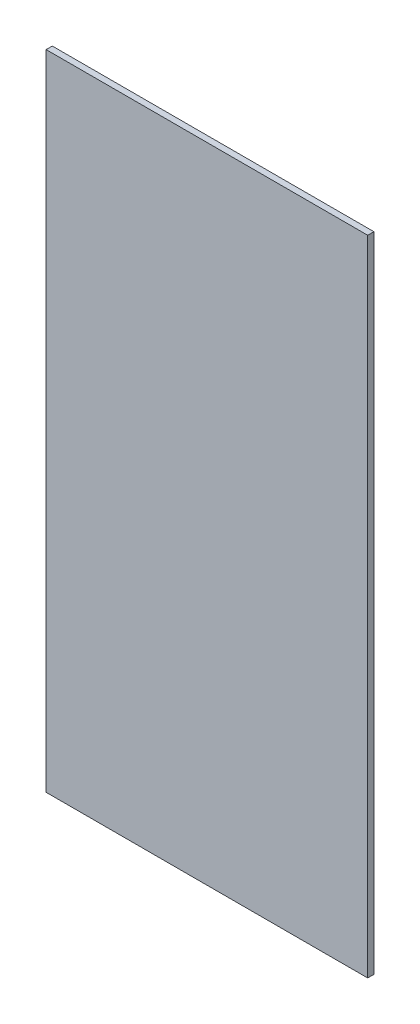
ISO-10303-21;
HEADER;
FILE_DESCRIPTION(('STEP AP214'),'2;1');
FILE_NAME('part.step','',(''),(''),'','','');
FILE_SCHEMA(('AUTOMOTIVE_DESIGN { 1 0 10303 214 1 1 1 1 }'));
ENDSEC;
DATA;
#1=APPLICATION_CONTEXT('core data for automotive mechanical design processes');
#2=APPLICATION_PROTOCOL_DEFINITION('international standard','automotive_design',2000,#1);
#3=PRODUCT_CONTEXT('',#1,'mechanical');
#4=PRODUCT('Part','Part','',(#3));
#5=PRODUCT_RELATED_PRODUCT_CATEGORY('part','',(#4));
#6=PRODUCT_DEFINITION_FORMATION('','',#4);
#7=PRODUCT_DEFINITION_CONTEXT('part definition',#1,'design');
#8=PRODUCT_DEFINITION('design','',#6,#7);
#9=PRODUCT_DEFINITION_SHAPE('','',#8);
#10=(LENGTH_UNIT() NAMED_UNIT(*) SI_UNIT(.MILLI.,.METRE.));
#11=(NAMED_UNIT(*) PLANE_ANGLE_UNIT() SI_UNIT($,.RADIAN.));
#12=(NAMED_UNIT(*) SI_UNIT($,.STERADIAN.) SOLID_ANGLE_UNIT());
#13=UNCERTAINTY_MEASURE_WITH_UNIT(LENGTH_MEASURE(1.E-05),#10,'distance_accuracy_value','');
#14=(GEOMETRIC_REPRESENTATION_CONTEXT(3) GLOBAL_UNCERTAINTY_ASSIGNED_CONTEXT((#13)) GLOBAL_UNIT_ASSIGNED_CONTEXT((#10,
#11,#12)) REPRESENTATION_CONTEXT('',''));
#15=CARTESIAN_POINT('',(0.,0.,0.));
#16=DIRECTION('',(0.,0.,1.));
#17=DIRECTION('',(1.,0.,0.));
#18=AXIS2_PLACEMENT_3D('',#15,#16,#17);
#19=CARTESIAN_POINT('',(-82.5500000000001,165.1,3.175));
#20=DIRECTION('',(1.,0.,0.));
#21=DIRECTION('',(0.,1.,0.));
#22=AXIS2_PLACEMENT_3D('',#19,#20,#21);
#23=PLANE('',#22);
#24=DIRECTION('',(0.,-1.,0.));
#25=VECTOR('',#24,1.);
#26=CARTESIAN_POINT('',(-82.5500000000001,165.1,0.));
#27=LINE('',#26,#25);
#28=CARTESIAN_POINT('',(-82.5500000000001,165.1,0.));
#29=VERTEX_POINT('',#28);
#30=CARTESIAN_POINT('',(-82.55,-165.1,0.));
#31=VERTEX_POINT('',#30);
#32=EDGE_CURVE('E107',#29,#31,#27,.T.);
#33=ORIENTED_EDGE('',*,*,#32,.T.);
#34=DIRECTION('',(0.,0.,-1.));
#35=VECTOR('',#34,1.);
#36=CARTESIAN_POINT('',(-82.55,-165.1,3.175));
#37=LINE('',#36,#35);
#38=CARTESIAN_POINT('',(-82.55,-165.1,3.175));
#39=VERTEX_POINT('',#38);
#40=EDGE_CURVE('E11',#39,#31,#37,.T.);
#41=ORIENTED_EDGE('',*,*,#40,.F.);
#42=DIRECTION('',(0.,-1.,0.));
#43=VECTOR('',#42,1.);
#44=CARTESIAN_POINT('',(-82.5500000000001,165.1,3.175));
#45=LINE('',#44,#43);
#46=CARTESIAN_POINT('',(-82.5500000000001,165.1,3.175));
#47=VERTEX_POINT('',#46);
#48=EDGE_CURVE('E90',#47,#39,#45,.T.);
#49=ORIENTED_EDGE('',*,*,#48,.F.);
#50=DIRECTION('',(0.,0.,-1.));
#51=VECTOR('',#50,1.);
#52=CARTESIAN_POINT('',(-82.5500000000001,165.1,3.175));
#53=LINE('',#52,#51);
#54=EDGE_CURVE('E103',#47,#29,#53,.T.);
#55=ORIENTED_EDGE('',*,*,#54,.T.);
#56=EDGE_LOOP('',(#33,#41,#49,#55));
#57=FACE_BOUND('',#56,.T.);
#58=ADVANCED_FACE('F38',(#57),#23,.F.);
#59=CARTESIAN_POINT('',(-82.55,-165.1,3.175));
#60=DIRECTION('',(0.,1.,0.));
#61=DIRECTION('',(-1.,0.,0.));
#62=AXIS2_PLACEMENT_3D('',#59,#60,#61);
#63=PLANE('',#62);
#64=DIRECTION('',(1.,0.,0.));
#65=VECTOR('',#64,1.);
#66=CARTESIAN_POINT('',(-82.55,-165.1,0.));
#67=LINE('',#66,#65);
#68=CARTESIAN_POINT('',(82.55,-165.1,0.));
#69=VERTEX_POINT('',#68);
#70=EDGE_CURVE('E95',#31,#69,#67,.T.);
#71=ORIENTED_EDGE('',*,*,#70,.T.);
#72=DIRECTION('',(0.,0.,-1.));
#73=VECTOR('',#72,1.);
#74=CARTESIAN_POINT('',(82.55,-165.1,3.175));
#75=LINE('',#74,#73);
#76=CARTESIAN_POINT('',(82.55,-165.1,3.175));
#77=VERTEX_POINT('',#76);
#78=EDGE_CURVE('E47',#77,#69,#75,.T.);
#79=ORIENTED_EDGE('',*,*,#78,.F.);
#80=DIRECTION('',(1.,0.,0.));
#81=VECTOR('',#80,1.);
#82=CARTESIAN_POINT('',(-82.55,-165.1,3.175));
#83=LINE('',#82,#81);
#84=EDGE_CURVE('E85',#39,#77,#83,.T.);
#85=ORIENTED_EDGE('',*,*,#84,.F.);
#86=ORIENTED_EDGE('',*,*,#40,.T.);
#87=EDGE_LOOP('',(#71,#79,#85,#86));
#88=FACE_BOUND('',#87,.T.);
#89=ADVANCED_FACE('F94',(#88),#63,.F.);
#90=CARTESIAN_POINT('',(82.5499999999999,165.1,3.175));
#91=DIRECTION('',(-1.,0.,0.));
#92=DIRECTION('',(0.,-1.,0.));
#93=AXIS2_PLACEMENT_3D('',#90,#91,#92);
#94=PLANE('',#93);
#95=DIRECTION('',(0.,1.,0.));
#96=VECTOR('',#95,1.);
#97=CARTESIAN_POINT('',(82.5499999999999,165.1,0.));
#98=LINE('',#97,#96);
#99=CARTESIAN_POINT('',(82.5499999999999,165.1,0.));
#100=VERTEX_POINT('',#99);
#101=EDGE_CURVE('E72',#69,#100,#98,.T.);
#102=ORIENTED_EDGE('',*,*,#101,.T.);
#103=DIRECTION('',(0.,0.,-1.));
#104=VECTOR('',#103,1.);
#105=CARTESIAN_POINT('',(82.5499999999999,165.1,3.175));
#106=LINE('',#105,#104);
#107=CARTESIAN_POINT('',(82.5499999999999,165.1,3.175));
#108=VERTEX_POINT('',#107);
#109=EDGE_CURVE('E97',#108,#100,#106,.T.);
#110=ORIENTED_EDGE('',*,*,#109,.F.);
#111=DIRECTION('',(0.,1.,0.));
#112=VECTOR('',#111,1.);
#113=CARTESIAN_POINT('',(82.5499999999999,165.1,3.175));
#114=LINE('',#113,#112);
#115=EDGE_CURVE('E88',#77,#108,#114,.T.);
#116=ORIENTED_EDGE('',*,*,#115,.F.);
#117=ORIENTED_EDGE('',*,*,#78,.T.);
#118=EDGE_LOOP('',(#102,#110,#116,#117));
#119=FACE_BOUND('',#118,.T.);
#120=ADVANCED_FACE('F98',(#119),#94,.F.);
#121=CARTESIAN_POINT('',(-82.5500000000001,165.1,3.175));
#122=DIRECTION('',(0.,-1.,0.));
#123=DIRECTION('',(1.,0.,0.));
#124=AXIS2_PLACEMENT_3D('',#121,#122,#123);
#125=PLANE('',#124);
#126=DIRECTION('',(-1.,0.,0.));
#127=VECTOR('',#126,1.);
#128=CARTESIAN_POINT('',(-82.5500000000001,165.1,0.));
#129=LINE('',#128,#127);
#130=EDGE_CURVE('E78',#100,#29,#129,.T.);
#131=ORIENTED_EDGE('',*,*,#130,.T.);
#132=ORIENTED_EDGE('',*,*,#54,.F.);
#133=DIRECTION('',(-1.,0.,0.));
#134=VECTOR('',#133,1.);
#135=CARTESIAN_POINT('',(-82.5500000000001,165.1,3.175));
#136=LINE('',#135,#134);
#137=EDGE_CURVE('E55',#108,#47,#136,.T.);
#138=ORIENTED_EDGE('',*,*,#137,.F.);
#139=ORIENTED_EDGE('',*,*,#109,.T.);
#140=EDGE_LOOP('',(#131,#132,#138,#139));
#141=FACE_BOUND('',#140,.T.);
#142=ADVANCED_FACE('F121',(#141),#125,.F.);
#143=CARTESIAN_POINT('',(0.,0.,3.175));
#144=DIRECTION('',(0.,0.,1.));
#145=DIRECTION('',(1.,0.,0.));
#146=AXIS2_PLACEMENT_3D('',#143,#144,#145);
#147=PLANE('',#146);
#148=ORIENTED_EDGE('',*,*,#48,.T.);
#149=ORIENTED_EDGE('',*,*,#84,.T.);
#150=ORIENTED_EDGE('',*,*,#115,.T.);
#151=ORIENTED_EDGE('',*,*,#137,.T.);
#152=EDGE_LOOP('',(#148,#149,#150,#151));
#153=FACE_BOUND('',#152,.T.);
#154=ADVANCED_FACE('F86',(#153),#147,.T.);
#155=CARTESIAN_POINT('',(0.,0.,0.));
#156=DIRECTION('',(0.,0.,1.));
#157=DIRECTION('',(1.,0.,0.));
#158=AXIS2_PLACEMENT_3D('',#155,#156,#157);
#159=PLANE('',#158);
#160=ORIENTED_EDGE('',*,*,#32,.F.);
#161=ORIENTED_EDGE('',*,*,#130,.F.);
#162=ORIENTED_EDGE('',*,*,#101,.F.);
#163=ORIENTED_EDGE('',*,*,#70,.F.);
#164=EDGE_LOOP('',(#160,#161,#162,#163));
#165=FACE_BOUND('',#164,.T.);
#166=ADVANCED_FACE('F124',(#165),#159,.F.);
#167=CLOSED_SHELL('',(#58,#89,#120,#142,#154,#166));
#168=MANIFOLD_SOLID_BREP('B2',#167);
#169=ADVANCED_BREP_SHAPE_REPRESENTATION('',(#18,#168),#14);
#170=SHAPE_DEFINITION_REPRESENTATION(#9,#169);
ENDSEC;
END-ISO-10303-21;
